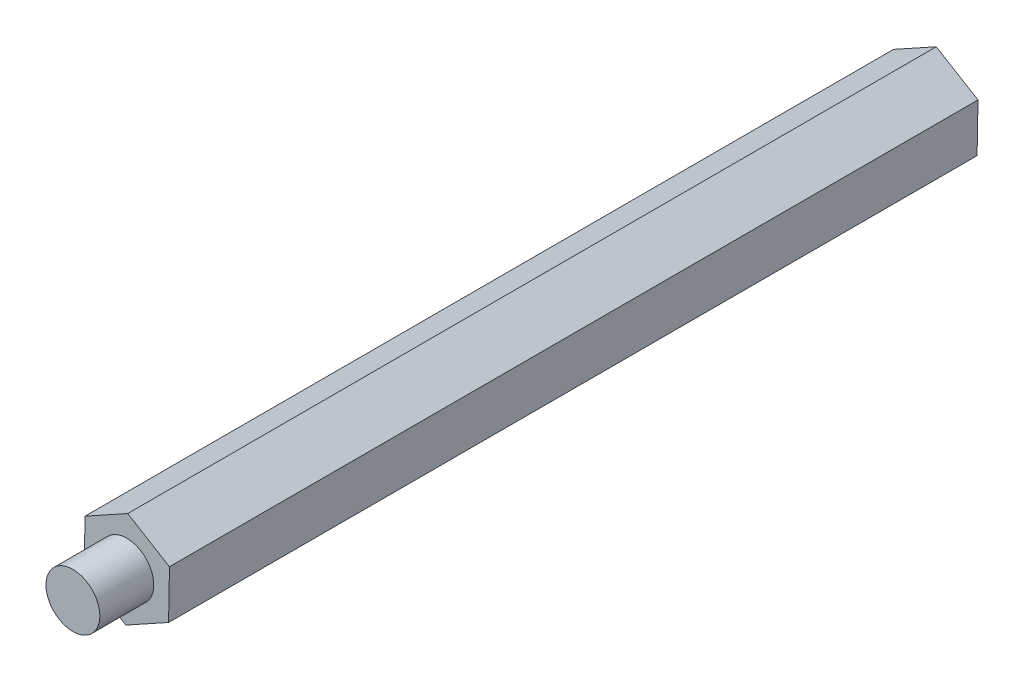
ISO-10303-21;
HEADER;
FILE_DESCRIPTION(('STEP AP214'),'2;1');
FILE_NAME('part.step','',(''),(''),'','','');
FILE_SCHEMA(('AUTOMOTIVE_DESIGN { 1 0 10303 214 1 1 1 1 }'));
ENDSEC;
DATA;
#1=APPLICATION_CONTEXT('core data for automotive mechanical design processes');
#2=APPLICATION_PROTOCOL_DEFINITION('international standard','automotive_design',2000,#1);
#3=PRODUCT_CONTEXT('',#1,'mechanical');
#4=PRODUCT('Part','Part','',(#3));
#5=PRODUCT_RELATED_PRODUCT_CATEGORY('part','',(#4));
#6=PRODUCT_DEFINITION_FORMATION('','',#4);
#7=PRODUCT_DEFINITION_CONTEXT('part definition',#1,'design');
#8=PRODUCT_DEFINITION('design','',#6,#7);
#9=PRODUCT_DEFINITION_SHAPE('','',#8);
#10=(LENGTH_UNIT() NAMED_UNIT(*) SI_UNIT(.MILLI.,.METRE.));
#11=(NAMED_UNIT(*) PLANE_ANGLE_UNIT() SI_UNIT($,.RADIAN.));
#12=(NAMED_UNIT(*) SI_UNIT($,.STERADIAN.) SOLID_ANGLE_UNIT());
#13=UNCERTAINTY_MEASURE_WITH_UNIT(LENGTH_MEASURE(1.E-05),#10,'distance_accuracy_value','');
#14=(GEOMETRIC_REPRESENTATION_CONTEXT(3) GLOBAL_UNCERTAINTY_ASSIGNED_CONTEXT((#13)) GLOBAL_UNIT_ASSIGNED_CONTEXT((#10,
#11,#12)) REPRESENTATION_CONTEXT('',''));
#15=CARTESIAN_POINT('',(0.,0.,0.));
#16=DIRECTION('',(0.,0.,1.));
#17=DIRECTION('',(1.,0.,0.));
#18=AXIS2_PLACEMENT_3D('',#15,#16,#17);
#19=CARTESIAN_POINT('',(0.0507511059576976,2.71307162798504,45.));
#20=DIRECTION('',(0.483715381528788,-0.875225359363209,0.));
#21=DIRECTION('',(0.875225359363209,0.483715381528788,0.));
#22=AXIS2_PLACEMENT_3D('',#19,#20,#21);
#23=PLANE('',#22);
#24=DIRECTION('',(-0.875225359363209,-0.483715381528788,0.));
#25=VECTOR('',#24,1.);
#26=CARTESIAN_POINT('',(0.0507511059576976,2.71307162798504,0.));
#27=LINE('',#26,#25);
#28=CARTESIAN_POINT('',(0.0507511059576976,2.71307162798504,0.));
#29=VERTEX_POINT('',#28);
#30=CARTESIAN_POINT('',(-2.324213399143,1.40048756102204,0.));
#31=VERTEX_POINT('',#30);
#32=EDGE_CURVE('E134',#29,#31,#27,.T.);
#33=ORIENTED_EDGE('',*,*,#32,.T.);
#34=DIRECTION('',(0.,0.,-1.));
#35=VECTOR('',#34,1.);
#36=CARTESIAN_POINT('',(-2.324213399143,1.40048756102204,45.));
#37=LINE('',#36,#35);
#38=CARTESIAN_POINT('',(-2.324213399143,1.40048756102204,45.));
#39=VERTEX_POINT('',#38);
#40=EDGE_CURVE('E46',#39,#31,#37,.T.);
#41=ORIENTED_EDGE('',*,*,#40,.F.);
#42=DIRECTION('',(-0.875225359363209,-0.483715381528788,0.));
#43=VECTOR('',#42,1.);
#44=CARTESIAN_POINT('',(0.0507511059576976,2.71307162798504,45.));
#45=LINE('',#44,#43);
#46=CARTESIAN_POINT('',(0.0507511059576976,2.71307162798504,45.));
#47=VERTEX_POINT('',#46);
#48=EDGE_CURVE('E151',#47,#39,#45,.T.);
#49=ORIENTED_EDGE('',*,*,#48,.F.);
#50=DIRECTION('',(0.,0.,-1.));
#51=VECTOR('',#50,1.);
#52=CARTESIAN_POINT('',(0.0507511059576976,2.71307162798504,45.));
#53=LINE('',#52,#51);
#54=EDGE_CURVE('E130',#47,#29,#53,.T.);
#55=ORIENTED_EDGE('',*,*,#54,.T.);
#56=EDGE_LOOP('',(#33,#41,#49,#55));
#57=FACE_BOUND('',#56,.T.);
#58=ADVANCED_FACE('F43',(#57),#23,.F.);
#59=CARTESIAN_POINT('',(-2.324213399143,1.40048756102204,45.));
#60=DIRECTION('',(0.999825086009298,-0.0187028710763916,0.));
#61=DIRECTION('',(0.0187028710763916,0.999825086009298,0.));
#62=AXIS2_PLACEMENT_3D('',#59,#60,#61);
#63=PLANE('',#62);
#64=DIRECTION('',(-0.0187028710763916,-0.999825086009298,0.));
#65=VECTOR('',#64,1.);
#66=CARTESIAN_POINT('',(-2.324213399143,1.40048756102204,0.));
#67=LINE('',#66,#65);
#68=CARTESIAN_POINT('',(-2.3749645051007,-1.312584066963,0.));
#69=VERTEX_POINT('',#68);
#70=EDGE_CURVE('E138',#31,#69,#67,.T.);
#71=ORIENTED_EDGE('',*,*,#70,.T.);
#72=DIRECTION('',(0.,0.,-1.));
#73=VECTOR('',#72,1.);
#74=CARTESIAN_POINT('',(-2.3749645051007,-1.312584066963,45.));
#75=LINE('',#74,#73);
#76=CARTESIAN_POINT('',(-2.3749645051007,-1.312584066963,45.));
#77=VERTEX_POINT('',#76);
#78=EDGE_CURVE('E157',#77,#69,#75,.T.);
#79=ORIENTED_EDGE('',*,*,#78,.F.);
#80=DIRECTION('',(-0.0187028710763916,-0.999825086009298,0.));
#81=VECTOR('',#80,1.);
#82=CARTESIAN_POINT('',(-2.324213399143,1.40048756102204,45.));
#83=LINE('',#82,#81);
#84=EDGE_CURVE('E99',#39,#77,#83,.T.);
#85=ORIENTED_EDGE('',*,*,#84,.F.);
#86=ORIENTED_EDGE('',*,*,#40,.T.);
#87=EDGE_LOOP('',(#71,#79,#85,#86));
#88=FACE_BOUND('',#87,.T.);
#89=ADVANCED_FACE('F164',(#88),#63,.F.);
#90=CARTESIAN_POINT('',(-2.3749645051007,-1.312584066963,45.));
#91=DIRECTION('',(0.51610970448051,0.856522488286817,0.));
#92=DIRECTION('',(-0.856522488286817,0.51610970448051,0.));
#93=AXIS2_PLACEMENT_3D('',#90,#91,#92);
#94=PLANE('',#93);
#95=DIRECTION('',(0.856522488286817,-0.51610970448051,0.));
#96=VECTOR('',#95,1.);
#97=CARTESIAN_POINT('',(-2.3749645051007,-1.312584066963,0.));
#98=LINE('',#97,#96);
#99=CARTESIAN_POINT('',(-0.0507511059576958,-2.71307162798504,0.));
#100=VERTEX_POINT('',#99);
#101=EDGE_CURVE('E142',#69,#100,#98,.T.);
#102=ORIENTED_EDGE('',*,*,#101,.T.);
#103=DIRECTION('',(0.,0.,-1.));
#104=VECTOR('',#103,1.);
#105=CARTESIAN_POINT('',(-0.0507511059576958,-2.71307162798504,45.));
#106=LINE('',#105,#104);
#107=CARTESIAN_POINT('',(-0.0507511059576958,-2.71307162798504,45.));
#108=VERTEX_POINT('',#107);
#109=EDGE_CURVE('E123',#108,#100,#106,.T.);
#110=ORIENTED_EDGE('',*,*,#109,.F.);
#111=DIRECTION('',(0.856522488286817,-0.51610970448051,0.));
#112=VECTOR('',#111,1.);
#113=CARTESIAN_POINT('',(-2.3749645051007,-1.312584066963,45.));
#114=LINE('',#113,#112);
#115=EDGE_CURVE('E112',#77,#108,#114,.T.);
#116=ORIENTED_EDGE('',*,*,#115,.F.);
#117=ORIENTED_EDGE('',*,*,#78,.T.);
#118=EDGE_LOOP('',(#102,#110,#116,#117));
#119=FACE_BOUND('',#118,.T.);
#120=ADVANCED_FACE('F170',(#119),#94,.F.);
#121=CARTESIAN_POINT('',(-0.0507511059576958,-2.71307162798504,45.));
#122=DIRECTION('',(-0.483715381528788,0.87522535936321,0.));
#123=DIRECTION('',(-0.87522535936321,-0.483715381528788,0.));
#124=AXIS2_PLACEMENT_3D('',#121,#122,#123);
#125=PLANE('',#124);
#126=DIRECTION('',(0.875225359363209,0.483715381528788,0.));
#127=VECTOR('',#126,1.);
#128=CARTESIAN_POINT('',(-0.0507511059576958,-2.71307162798504,0.));
#129=LINE('',#128,#127);
#130=CARTESIAN_POINT('',(2.324213399143,-1.40048756102204,0.));
#131=VERTEX_POINT('',#130);
#132=EDGE_CURVE('E121',#100,#131,#129,.T.);
#133=ORIENTED_EDGE('',*,*,#132,.T.);
#134=DIRECTION('',(0.,0.,-1.));
#135=VECTOR('',#134,1.);
#136=CARTESIAN_POINT('',(2.324213399143,-1.40048756102204,45.));
#137=LINE('',#136,#135);
#138=CARTESIAN_POINT('',(2.324213399143,-1.40048756102204,45.));
#139=VERTEX_POINT('',#138);
#140=EDGE_CURVE('E118',#139,#131,#137,.T.);
#141=ORIENTED_EDGE('',*,*,#140,.F.);
#142=DIRECTION('',(0.875225359363209,0.483715381528788,0.));
#143=VECTOR('',#142,1.);
#144=CARTESIAN_POINT('',(-0.0507511059576958,-2.71307162798504,45.));
#145=LINE('',#144,#143);
#146=EDGE_CURVE('E106',#108,#139,#145,.T.);
#147=ORIENTED_EDGE('',*,*,#146,.F.);
#148=ORIENTED_EDGE('',*,*,#109,.T.);
#149=EDGE_LOOP('',(#133,#141,#147,#148));
#150=FACE_BOUND('',#149,.T.);
#151=ADVANCED_FACE('F119',(#150),#125,.F.);
#152=CARTESIAN_POINT('',(2.324213399143,-1.40048756102204,45.));
#153=DIRECTION('',(-0.999825086009298,0.0187028710763917,0.));
#154=DIRECTION('',(-0.0187028710763917,-0.999825086009298,0.));
#155=AXIS2_PLACEMENT_3D('',#152,#153,#154);
#156=PLANE('',#155);
#157=DIRECTION('',(0.0187028710763917,0.999825086009298,0.));
#158=VECTOR('',#157,1.);
#159=CARTESIAN_POINT('',(2.324213399143,-1.40048756102204,0.));
#160=LINE('',#159,#158);
#161=CARTESIAN_POINT('',(2.3749645051007,1.312584066963,0.));
#162=VERTEX_POINT('',#161);
#163=EDGE_CURVE('E84',#131,#162,#160,.T.);
#164=ORIENTED_EDGE('',*,*,#163,.T.);
#165=DIRECTION('',(0.,0.,-1.));
#166=VECTOR('',#165,1.);
#167=CARTESIAN_POINT('',(2.3749645051007,1.312584066963,45.));
#168=LINE('',#167,#166);
#169=CARTESIAN_POINT('',(2.3749645051007,1.312584066963,45.));
#170=VERTEX_POINT('',#169);
#171=EDGE_CURVE('E124',#170,#162,#168,.T.);
#172=ORIENTED_EDGE('',*,*,#171,.F.);
#173=DIRECTION('',(0.0187028710763917,0.999825086009298,0.));
#174=VECTOR('',#173,1.);
#175=CARTESIAN_POINT('',(2.324213399143,-1.40048756102204,45.));
#176=LINE('',#175,#174);
#177=EDGE_CURVE('E110',#139,#170,#176,.T.);
#178=ORIENTED_EDGE('',*,*,#177,.F.);
#179=ORIENTED_EDGE('',*,*,#140,.T.);
#180=EDGE_LOOP('',(#164,#172,#178,#179));
#181=FACE_BOUND('',#180,.T.);
#182=ADVANCED_FACE('F126',(#181),#156,.F.);
#183=CARTESIAN_POINT('',(2.3749645051007,1.312584066963,45.));
#184=DIRECTION('',(-0.51610970448051,-0.856522488286817,0.));
#185=DIRECTION('',(0.856522488286817,-0.51610970448051,0.));
#186=AXIS2_PLACEMENT_3D('',#183,#184,#185);
#187=PLANE('',#186);
#188=DIRECTION('',(-0.856522488286817,0.51610970448051,0.));
#189=VECTOR('',#188,1.);
#190=CARTESIAN_POINT('',(2.3749645051007,1.312584066963,0.));
#191=LINE('',#190,#189);
#192=EDGE_CURVE('E90',#162,#29,#191,.T.);
#193=ORIENTED_EDGE('',*,*,#192,.T.);
#194=ORIENTED_EDGE('',*,*,#54,.F.);
#195=DIRECTION('',(-0.856522488286817,0.51610970448051,0.));
#196=VECTOR('',#195,1.);
#197=CARTESIAN_POINT('',(2.3749645051007,1.312584066963,45.));
#198=LINE('',#197,#196);
#199=EDGE_CURVE('E61',#170,#47,#198,.T.);
#200=ORIENTED_EDGE('',*,*,#199,.F.);
#201=ORIENTED_EDGE('',*,*,#171,.T.);
#202=EDGE_LOOP('',(#193,#194,#200,#201));
#203=FACE_BOUND('',#202,.T.);
#204=ADVANCED_FACE('F207',(#203),#187,.F.);
#205=CARTESIAN_POINT('',(0.,0.,45.));
#206=DIRECTION('',(0.,0.,1.));
#207=DIRECTION('',(1.,0.,0.));
#208=AXIS2_PLACEMENT_3D('',#205,#206,#207);
#209=PLANE('',#208);
#210=CARTESIAN_POINT('',(0.,0.,45.));
#211=DIRECTION('',(0.,0.,1.));
#212=DIRECTION('',(1.,0.,0.));
#213=AXIS2_PLACEMENT_3D('',#210,#211,#212);
#214=CIRCLE('',#213,1.5);
#215=CARTESIAN_POINT('',(1.5,0.,45.));
#216=VERTEX_POINT('',#215);
#217=EDGE_CURVE('E11',#216,#216,#214,.T.);
#218=ORIENTED_EDGE('',*,*,#217,.F.);
#219=EDGE_LOOP('',(#218));
#220=FACE_BOUND('',#219,.T.);
#221=ORIENTED_EDGE('',*,*,#48,.T.);
#222=ORIENTED_EDGE('',*,*,#84,.T.);
#223=ORIENTED_EDGE('',*,*,#115,.T.);
#224=ORIENTED_EDGE('',*,*,#146,.T.);
#225=ORIENTED_EDGE('',*,*,#177,.T.);
#226=ORIENTED_EDGE('',*,*,#199,.T.);
#227=EDGE_LOOP('',(#221,#222,#223,#224,#225,#226));
#228=FACE_BOUND('',#227,.T.);
#229=ADVANCED_FACE('F108',(#220,#228),#209,.T.);
#230=CARTESIAN_POINT('',(0.,0.,0.));
#231=DIRECTION('',(0.,0.,1.));
#232=DIRECTION('',(1.,0.,0.));
#233=AXIS2_PLACEMENT_3D('',#230,#231,#232);
#234=PLANE('',#233);
#235=CARTESIAN_POINT('',(0.,0.,0.));
#236=DIRECTION('',(0.,0.,-1.));
#237=DIRECTION('',(-1.,0.,0.));
#238=AXIS2_PLACEMENT_3D('',#235,#236,#237);
#239=CIRCLE('',#238,1.5);
#240=CARTESIAN_POINT('',(-1.5,0.,0.));
#241=VERTEX_POINT('',#240);
#242=EDGE_CURVE('E181',#241,#241,#239,.T.);
#243=ORIENTED_EDGE('',*,*,#242,.F.);
#244=EDGE_LOOP('',(#243));
#245=FACE_BOUND('',#244,.T.);
#246=ORIENTED_EDGE('',*,*,#32,.F.);
#247=ORIENTED_EDGE('',*,*,#192,.F.);
#248=ORIENTED_EDGE('',*,*,#163,.F.);
#249=ORIENTED_EDGE('',*,*,#132,.F.);
#250=ORIENTED_EDGE('',*,*,#101,.F.);
#251=ORIENTED_EDGE('',*,*,#70,.F.);
#252=EDGE_LOOP('',(#246,#247,#248,#249,#250,#251));
#253=FACE_BOUND('',#252,.T.);
#254=ADVANCED_FACE('F169',(#245,#253),#234,.F.);
#255=CARTESIAN_POINT('',(0.,0.,48.));
#256=DIRECTION('',(0.,0.,-1.));
#257=DIRECTION('',(-1.,0.,0.));
#258=AXIS2_PLACEMENT_3D('',#255,#256,#257);
#259=CYLINDRICAL_SURFACE('',#258,1.5);
#260=CARTESIAN_POINT('',(0.,0.,48.));
#261=DIRECTION('',(0.,0.,1.));
#262=DIRECTION('',(1.,0.,0.));
#263=AXIS2_PLACEMENT_3D('',#260,#261,#262);
#264=CIRCLE('',#263,1.5);
#265=CARTESIAN_POINT('',(1.5,0.,48.));
#266=VERTEX_POINT('',#265);
#267=EDGE_CURVE('E139',#266,#266,#264,.T.);
#268=ORIENTED_EDGE('',*,*,#267,.F.);
#269=EDGE_LOOP('',(#268));
#270=FACE_BOUND('',#269,.T.);
#271=ORIENTED_EDGE('',*,*,#217,.T.);
#272=EDGE_LOOP('',(#271));
#273=FACE_BOUND('',#272,.T.);
#274=ADVANCED_FACE('F199',(#270,#273),#259,.T.);
#275=CARTESIAN_POINT('',(0.,0.,48.));
#276=DIRECTION('',(0.,0.,1.));
#277=DIRECTION('',(1.,0.,0.));
#278=AXIS2_PLACEMENT_3D('',#275,#276,#277);
#279=PLANE('',#278);
#280=ORIENTED_EDGE('',*,*,#267,.T.);
#281=EDGE_LOOP('',(#280));
#282=FACE_BOUND('',#281,.T.);
#283=ADVANCED_FACE('F194',(#282),#279,.T.);
#284=CARTESIAN_POINT('',(0.,0.,3.));
#285=DIRECTION('',(0.,0.,-1.));
#286=DIRECTION('',(-1.,0.,0.));
#287=AXIS2_PLACEMENT_3D('',#284,#285,#286);
#288=CYLINDRICAL_SURFACE('',#287,1.5);
#289=CARTESIAN_POINT('',(0.,0.,3.));
#290=DIRECTION('',(0.,0.,-1.));
#291=DIRECTION('',(-1.,0.,0.));
#292=AXIS2_PLACEMENT_3D('',#289,#290,#291);
#293=CIRCLE('',#292,1.5);
#294=CARTESIAN_POINT('',(-1.5,0.,3.));
#295=VERTEX_POINT('',#294);
#296=EDGE_CURVE('E180',#295,#295,#293,.T.);
#297=ORIENTED_EDGE('',*,*,#296,.F.);
#298=EDGE_LOOP('',(#297));
#299=FACE_BOUND('',#298,.T.);
#300=ORIENTED_EDGE('',*,*,#242,.T.);
#301=EDGE_LOOP('',(#300));
#302=FACE_BOUND('',#301,.T.);
#303=ADVANCED_FACE('F191',(#299,#302),#288,.F.);
#304=CARTESIAN_POINT('',(0.,0.,3.));
#305=DIRECTION('',(0.,0.,-1.));
#306=DIRECTION('',(-1.,0.,0.));
#307=AXIS2_PLACEMENT_3D('',#304,#305,#306);
#308=PLANE('',#307);
#309=ORIENTED_EDGE('',*,*,#296,.T.);
#310=EDGE_LOOP('',(#309));
#311=FACE_BOUND('',#310,.T.);
#312=ADVANCED_FACE('F189',(#311),#308,.T.);
#313=CLOSED_SHELL('',(#58,#89,#120,#151,#182,#204,#229,#254,#274,#283,#303,#312));
#314=MANIFOLD_SOLID_BREP('B2',#313);
#315=ADVANCED_BREP_SHAPE_REPRESENTATION('',(#18,#314),#14);
#316=SHAPE_DEFINITION_REPRESENTATION(#9,#315);
ENDSEC;
END-ISO-10303-21;
